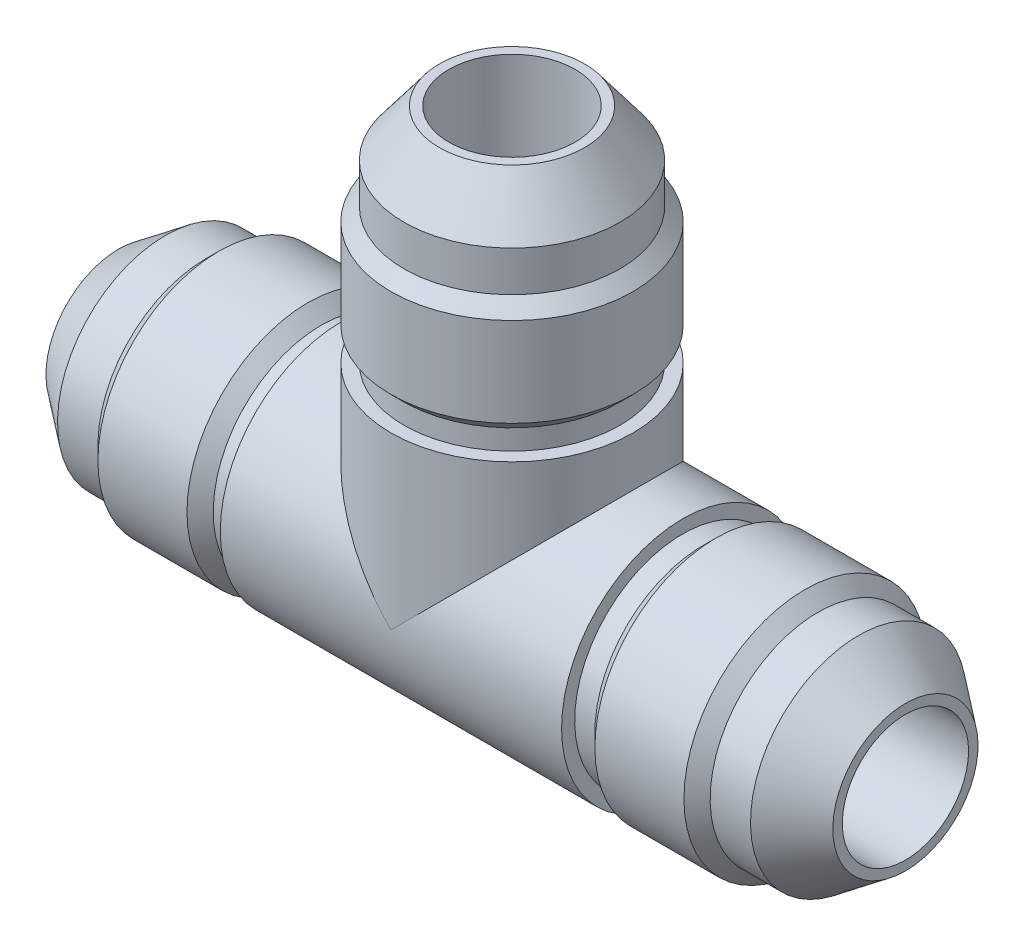
ISO-10303-21;
HEADER;
FILE_DESCRIPTION(('STEP AP214'),'2;1');
FILE_NAME('part.step','',(''),(''),'','','');
FILE_SCHEMA(('AUTOMOTIVE_DESIGN { 1 0 10303 214 1 1 1 1 }'));
ENDSEC;
DATA;
#1=APPLICATION_CONTEXT('core data for automotive mechanical design processes');
#2=APPLICATION_PROTOCOL_DEFINITION('international standard','automotive_design',2000,#1);
#3=PRODUCT_CONTEXT('',#1,'mechanical');
#4=PRODUCT('Part','Part','',(#3));
#5=PRODUCT_RELATED_PRODUCT_CATEGORY('part','',(#4));
#6=PRODUCT_DEFINITION_FORMATION('','',#4);
#7=PRODUCT_DEFINITION_CONTEXT('part definition',#1,'design');
#8=PRODUCT_DEFINITION('design','',#6,#7);
#9=PRODUCT_DEFINITION_SHAPE('','',#8);
#10=(LENGTH_UNIT() NAMED_UNIT(*) SI_UNIT(.MILLI.,.METRE.));
#11=(NAMED_UNIT(*) PLANE_ANGLE_UNIT() SI_UNIT($,.RADIAN.));
#12=(NAMED_UNIT(*) SI_UNIT($,.STERADIAN.) SOLID_ANGLE_UNIT());
#13=UNCERTAINTY_MEASURE_WITH_UNIT(LENGTH_MEASURE(1.E-05),#10,'distance_accuracy_value','');
#14=(GEOMETRIC_REPRESENTATION_CONTEXT(3) GLOBAL_UNCERTAINTY_ASSIGNED_CONTEXT((#13)) GLOBAL_UNIT_ASSIGNED_CONTEXT((#10,
#11,#12)) REPRESENTATION_CONTEXT('',''));
#15=CARTESIAN_POINT('',(0.,0.,0.));
#16=DIRECTION('',(0.,0.,1.));
#17=DIRECTION('',(1.,0.,0.));
#18=AXIS2_PLACEMENT_3D('',#15,#16,#17);
#19=CARTESIAN_POINT('',(0.,0.,0.));
#20=DIRECTION('',(0.,1.,0.));
#21=DIRECTION('',(0.,0.,1.));
#22=AXIS2_PLACEMENT_3D('',#19,#20,#21);
#23=CYLINDRICAL_SURFACE('',#22,9.525);
#24=CARTESIAN_POINT('',(0.,13.4239,0.));
#25=DIRECTION('',(0.,-1.,0.));
#26=DIRECTION('',(0.,0.,-1.));
#27=AXIS2_PLACEMENT_3D('',#24,#25,#26);
#28=CIRCLE('',#27,9.525);
#29=CARTESIAN_POINT('',(0.,13.4239,-9.525));
#30=VERTEX_POINT('',#29);
#31=EDGE_CURVE('E137',#30,#30,#28,.T.);
#32=ORIENTED_EDGE('',*,*,#31,.T.);
#33=EDGE_LOOP('',(#32));
#34=FACE_BOUND('',#33,.T.);
#35=CARTESIAN_POINT('',(0.,0.,0.));
#36=DIRECTION('',(-0.707106781186546,0.707106781186549,0.));
#37=DIRECTION('',(0.707106781186549,0.707106781186546,0.));
#38=AXIS2_PLACEMENT_3D('',#35,#36,#37);
#39=ELLIPSE('',#38,13.4703841816038,9.525);
#40=CARTESIAN_POINT('',(0.,0.,-9.525));
#41=VERTEX_POINT('',#40);
#42=CARTESIAN_POINT('',(0.,0.,9.525));
#43=VERTEX_POINT('',#42);
#44=EDGE_CURVE('E132',#41,#43,#39,.F.);
#45=ORIENTED_EDGE('',*,*,#44,.F.);
#46=CARTESIAN_POINT('',(0.,0.,0.));
#47=DIRECTION('',(0.707106781186549,0.707106781186546,0.));
#48=DIRECTION('',(-0.707106781186546,0.707106781186549,0.));
#49=AXIS2_PLACEMENT_3D('',#46,#47,#48);
#50=ELLIPSE('',#49,13.4703841816037,9.525);
#51=EDGE_CURVE('E59',#43,#41,#50,.F.);
#52=ORIENTED_EDGE('',*,*,#51,.F.);
#53=EDGE_LOOP('',(#45,#52));
#54=FACE_BOUND('',#53,.T.);
#55=ADVANCED_FACE('F40',(#34,#54),#23,.T.);
#56=CARTESIAN_POINT('',(1.08060998289061E-13,30.9499,0.));
#57=DIRECTION('',(0.,-1.,0.));
#58=DIRECTION('',(0.,0.,-1.));
#59=AXIS2_PLACEMENT_3D('',#56,#57,#58);
#60=CYLINDRICAL_SURFACE('',#59,4.9657);
#61=CARTESIAN_POINT('',(1.08060998289061E-13,30.9499,0.));
#62=DIRECTION('',(0.,-1.,0.));
#63=DIRECTION('',(0.,0.,-1.));
#64=AXIS2_PLACEMENT_3D('',#61,#62,#63);
#65=CIRCLE('',#64,4.9657);
#66=CARTESIAN_POINT('',(1.08060998289061E-13,30.9499,-4.9657));
#67=VERTEX_POINT('',#66);
#68=EDGE_CURVE('E134',#67,#67,#65,.T.);
#69=ORIENTED_EDGE('',*,*,#68,.F.);
#70=EDGE_LOOP('',(#69));
#71=FACE_BOUND('',#70,.T.);
#72=CARTESIAN_POINT('',(0.,0.,0.));
#73=DIRECTION('',(-0.707106781186549,-0.707106781186546,0.));
#74=DIRECTION('',(-0.707106781186546,0.707106781186549,0.));
#75=AXIS2_PLACEMENT_3D('',#72,#73,#74);
#76=ELLIPSE('',#75,7.02256028667607,4.9657);
#77=CARTESIAN_POINT('',(0.,0.,-4.9657));
#78=VERTEX_POINT('',#77);
#79=CARTESIAN_POINT('',(0.,0.,4.9657));
#80=VERTEX_POINT('',#79);
#81=EDGE_CURVE('E48',#78,#80,#76,.F.);
#82=ORIENTED_EDGE('',*,*,#81,.F.);
#83=CARTESIAN_POINT('',(0.,0.,0.));
#84=DIRECTION('',(-0.707106781186546,0.707106781186549,0.));
#85=DIRECTION('',(-0.707106781186549,-0.707106781186546,0.));
#86=AXIS2_PLACEMENT_3D('',#83,#84,#85);
#87=ELLIPSE('',#86,7.02256028667609,4.9657);
#88=EDGE_CURVE('E11',#80,#78,#87,.T.);
#89=ORIENTED_EDGE('',*,*,#88,.F.);
#90=EDGE_LOOP('',(#82,#89));
#91=FACE_BOUND('',#90,.T.);
#92=ADVANCED_FACE('F64',(#71,#91),#60,.F.);
#93=CARTESIAN_POINT('',(0.,13.4239,0.));
#94=DIRECTION('',(0.,1.,0.));
#95=DIRECTION('',(0.,0.,1.));
#96=AXIS2_PLACEMENT_3D('',#93,#94,#95);
#97=CYLINDRICAL_SURFACE('',#96,9.525);
#98=CARTESIAN_POINT('',(0.,16.0425114963809,0.));
#99=DIRECTION('',(0.,-1.,0.));
#100=DIRECTION('',(1.,0.,0.));
#101=AXIS2_PLACEMENT_3D('',#98,#99,#100);
#102=CIRCLE('',#101,9.52500000000001);
#103=CARTESIAN_POINT('',(9.52500000000006,16.0425114963808,0.));
#104=VERTEX_POINT('',#103);
#105=EDGE_CURVE('E146',#104,#104,#102,.T.);
#106=ORIENTED_EDGE('',*,*,#105,.F.);
#107=EDGE_LOOP('',(#106));
#108=FACE_BOUND('',#107,.T.);
#109=CARTESIAN_POINT('',(0.,23.0501801907987,0.));
#110=DIRECTION('',(0.,-1.,0.));
#111=DIRECTION('',(1.,0.,0.));
#112=AXIS2_PLACEMENT_3D('',#109,#110,#111);
#113=CIRCLE('',#112,9.52500000000001);
#114=CARTESIAN_POINT('',(9.52500000000008,23.0501801907987,0.));
#115=VERTEX_POINT('',#114);
#116=EDGE_CURVE('E149',#115,#115,#113,.T.);
#117=ORIENTED_EDGE('',*,*,#116,.T.);
#118=EDGE_LOOP('',(#117));
#119=FACE_BOUND('',#118,.T.);
#120=ADVANCED_FACE('F42',(#108,#119),#97,.T.);
#121=CARTESIAN_POINT('',(0.,24.0812916871796,0.));
#122=DIRECTION('',(0.,-1.,0.));
#123=DIRECTION('',(1.,0.,0.));
#124=AXIS2_PLACEMENT_3D('',#121,#122,#123);
#125=CONICAL_SURFACE('',#124,8.49388850361915,0.785398163397452);
#126=ORIENTED_EDGE('',*,*,#116,.F.);
#127=EDGE_LOOP('',(#126));
#128=FACE_BOUND('',#127,.T.);
#129=CARTESIAN_POINT('',(0.,24.0812916871796,0.));
#130=DIRECTION('',(0.,-1.,0.));
#131=DIRECTION('',(1.,0.,0.));
#132=AXIS2_PLACEMENT_3D('',#129,#130,#131);
#133=CIRCLE('',#132,8.49388850361915);
#134=CARTESIAN_POINT('',(8.49388850361923,24.0812916871795,0.));
#135=VERTEX_POINT('',#134);
#136=EDGE_CURVE('E66',#135,#135,#133,.T.);
#137=ORIENTED_EDGE('',*,*,#136,.T.);
#138=EDGE_LOOP('',(#137));
#139=FACE_BOUND('',#138,.T.);
#140=ADVANCED_FACE('F161',(#128,#139),#125,.T.);
#141=CARTESIAN_POINT('',(0.,0.,0.));
#142=DIRECTION('',(0.,-1.,0.));
#143=DIRECTION('',(1.,0.,0.));
#144=AXIS2_PLACEMENT_3D('',#141,#142,#143);
#145=CYLINDRICAL_SURFACE('',#144,8.49388850361915);
#146=ORIENTED_EDGE('',*,*,#136,.F.);
#147=EDGE_LOOP('',(#146));
#148=FACE_BOUND('',#147,.T.);
#149=CARTESIAN_POINT('',(0.,27.2562916871796,0.));
#150=DIRECTION('',(0.,-1.,0.));
#151=DIRECTION('',(1.,0.,0.));
#152=AXIS2_PLACEMENT_3D('',#149,#150,#151);
#153=CIRCLE('',#152,8.49388850361915);
#154=CARTESIAN_POINT('',(8.49388850361924,27.2562916871795,0.));
#155=VERTEX_POINT('',#154);
#156=EDGE_CURVE('E155',#155,#155,#153,.T.);
#157=ORIENTED_EDGE('',*,*,#156,.T.);
#158=EDGE_LOOP('',(#157));
#159=FACE_BOUND('',#158,.T.);
#160=ADVANCED_FACE('F163',(#148,#159),#145,.T.);
#161=CARTESIAN_POINT('',(1.04061451353436E-13,30.9499,0.));
#162=DIRECTION('',(0.,-1.,0.));
#163=DIRECTION('',(1.,0.,0.));
#164=AXIS2_PLACEMENT_3D('',#161,#162,#163);
#165=CONICAL_SURFACE('',#164,5.710555,0.645771823237897);
#166=ORIENTED_EDGE('',*,*,#156,.F.);
#167=EDGE_LOOP('',(#166));
#168=FACE_BOUND('',#167,.T.);
#169=CARTESIAN_POINT('',(1.04061451353436E-13,30.9499,0.));
#170=DIRECTION('',(0.,-1.,0.));
#171=DIRECTION('',(1.,0.,0.));
#172=AXIS2_PLACEMENT_3D('',#169,#170,#171);
#173=CIRCLE('',#172,5.710555);
#174=CARTESIAN_POINT('',(5.71055500000011,30.9499,0.));
#175=VERTEX_POINT('',#174);
#176=EDGE_CURVE('E152',#175,#175,#173,.T.);
#177=ORIENTED_EDGE('',*,*,#176,.T.);
#178=EDGE_LOOP('',(#177));
#179=FACE_BOUND('',#178,.T.);
#180=ADVANCED_FACE('F166',(#168,#179),#165,.T.);
#181=CARTESIAN_POINT('',(1.08060998289061E-13,30.9499,0.));
#182=DIRECTION('',(0.,-1.,0.));
#183=DIRECTION('',(0.,0.,-1.));
#184=AXIS2_PLACEMENT_3D('',#181,#182,#183);
#185=PLANE('',#184);
#186=ORIENTED_EDGE('',*,*,#68,.T.);
#187=EDGE_LOOP('',(#186));
#188=FACE_BOUND('',#187,.T.);
#189=ORIENTED_EDGE('',*,*,#176,.F.);
#190=EDGE_LOOP('',(#189));
#191=FACE_BOUND('',#190,.T.);
#192=ADVANCED_FACE('F172',(#188,#191),#185,.F.);
#193=CARTESIAN_POINT('',(0.,16.0425114963809,0.));
#194=DIRECTION('',(0.,1.,0.));
#195=DIRECTION('',(-1.,0.,0.));
#196=AXIS2_PLACEMENT_3D('',#193,#194,#195);
#197=CONICAL_SURFACE('',#196,9.52500000000001,0.785398163397448);
#198=CARTESIAN_POINT('',(0.,15.0114,0.));
#199=DIRECTION('',(0.,-1.,0.));
#200=DIRECTION('',(1.,0.,0.));
#201=AXIS2_PLACEMENT_3D('',#198,#199,#200);
#202=CIRCLE('',#201,8.49388850361915);
#203=CARTESIAN_POINT('',(8.4938885036192,15.0114,0.));
#204=VERTEX_POINT('',#203);
#205=EDGE_CURVE('E143',#204,#204,#202,.T.);
#206=ORIENTED_EDGE('',*,*,#205,.F.);
#207=EDGE_LOOP('',(#206));
#208=FACE_BOUND('',#207,.T.);
#209=ORIENTED_EDGE('',*,*,#105,.T.);
#210=EDGE_LOOP('',(#209));
#211=FACE_BOUND('',#210,.T.);
#212=ADVANCED_FACE('F177',(#208,#211),#197,.T.);
#213=CARTESIAN_POINT('',(0.,0.,0.));
#214=DIRECTION('',(0.,-1.,0.));
#215=DIRECTION('',(1.,0.,0.));
#216=AXIS2_PLACEMENT_3D('',#213,#214,#215);
#217=CYLINDRICAL_SURFACE('',#216,8.49388850361915);
#218=CARTESIAN_POINT('',(0.,13.4239,0.));
#219=DIRECTION('',(0.,-1.,0.));
#220=DIRECTION('',(1.,0.,0.));
#221=AXIS2_PLACEMENT_3D('',#218,#219,#220);
#222=CIRCLE('',#221,8.49388850361915);
#223=CARTESIAN_POINT('',(8.49388850361919,13.4239,0.));
#224=VERTEX_POINT('',#223);
#225=EDGE_CURVE('E140',#224,#224,#222,.T.);
#226=ORIENTED_EDGE('',*,*,#225,.F.);
#227=EDGE_LOOP('',(#226));
#228=FACE_BOUND('',#227,.T.);
#229=ORIENTED_EDGE('',*,*,#205,.T.);
#230=EDGE_LOOP('',(#229));
#231=FACE_BOUND('',#230,.T.);
#232=ADVANCED_FACE('F182',(#228,#231),#217,.T.);
#233=CARTESIAN_POINT('',(0.,13.4239,0.));
#234=DIRECTION('',(0.,-1.,0.));
#235=DIRECTION('',(0.,0.,-1.));
#236=AXIS2_PLACEMENT_3D('',#233,#234,#235);
#237=PLANE('',#236);
#238=ORIENTED_EDGE('',*,*,#31,.F.);
#239=EDGE_LOOP('',(#238));
#240=FACE_BOUND('',#239,.T.);
#241=ORIENTED_EDGE('',*,*,#225,.T.);
#242=EDGE_LOOP('',(#241));
#243=FACE_BOUND('',#242,.T.);
#244=ADVANCED_FACE('F196',(#240,#243),#237,.F.);
#245=CARTESIAN_POINT('',(0.,0.,0.));
#246=DIRECTION('',(-1.,0.,0.));
#247=DIRECTION('',(0.,0.,1.));
#248=AXIS2_PLACEMENT_3D('',#245,#246,#247);
#249=CYLINDRICAL_SURFACE('',#248,9.525);
#250=CARTESIAN_POINT('',(13.4239,0.,0.));
#251=DIRECTION('',(-1.,0.,0.));
#252=DIRECTION('',(0.,0.,-1.));
#253=AXIS2_PLACEMENT_3D('',#250,#251,#252);
#254=CIRCLE('',#253,9.525);
#255=CARTESIAN_POINT('',(13.4239,0.,-9.525));
#256=VERTEX_POINT('',#255);
#257=EDGE_CURVE('E80',#256,#256,#254,.T.);
#258=ORIENTED_EDGE('',*,*,#257,.T.);
#259=EDGE_LOOP('',(#258));
#260=FACE_BOUND('',#259,.T.);
#261=CARTESIAN_POINT('',(-13.4239,0.,0.));
#262=DIRECTION('',(1.,0.,0.));
#263=DIRECTION('',(0.,0.,-1.));
#264=AXIS2_PLACEMENT_3D('',#261,#262,#263);
#265=CIRCLE('',#264,9.525);
#266=CARTESIAN_POINT('',(-13.4239,0.,-9.525));
#267=VERTEX_POINT('',#266);
#268=EDGE_CURVE('E107',#267,#267,#265,.T.);
#269=ORIENTED_EDGE('',*,*,#268,.T.);
#270=EDGE_LOOP('',(#269));
#271=FACE_BOUND('',#270,.T.);
#272=ORIENTED_EDGE('',*,*,#51,.T.);
#273=ORIENTED_EDGE('',*,*,#44,.T.);
#274=EDGE_LOOP('',(#272,#273));
#275=FACE_BOUND('',#274,.T.);
#276=ADVANCED_FACE('F338',(#260,#271,#275),#249,.T.);
#277=CARTESIAN_POINT('',(-13.4239,0.,0.));
#278=DIRECTION('',(-1.,0.,0.));
#279=DIRECTION('',(0.,0.,1.));
#280=AXIS2_PLACEMENT_3D('',#277,#278,#279);
#281=CYLINDRICAL_SURFACE('',#280,9.525);
#282=CARTESIAN_POINT('',(-16.0425114963809,0.,0.));
#283=DIRECTION('',(1.,0.,0.));
#284=DIRECTION('',(0.,1.,0.));
#285=AXIS2_PLACEMENT_3D('',#282,#283,#284);
#286=CIRCLE('',#285,9.52500000000001);
#287=CARTESIAN_POINT('',(-16.0425114963809,9.525,0.));
#288=VERTEX_POINT('',#287);
#289=EDGE_CURVE('E116',#288,#288,#286,.T.);
#290=ORIENTED_EDGE('',*,*,#289,.F.);
#291=EDGE_LOOP('',(#290));
#292=FACE_BOUND('',#291,.T.);
#293=CARTESIAN_POINT('',(-23.0501801907987,0.,0.));
#294=DIRECTION('',(1.,0.,0.));
#295=DIRECTION('',(0.,1.,0.));
#296=AXIS2_PLACEMENT_3D('',#293,#294,#295);
#297=CIRCLE('',#296,9.52500000000001);
#298=CARTESIAN_POINT('',(-23.0501801907987,9.525,0.));
#299=VERTEX_POINT('',#298);
#300=EDGE_CURVE('E119',#299,#299,#297,.T.);
#301=ORIENTED_EDGE('',*,*,#300,.T.);
#302=EDGE_LOOP('',(#301));
#303=FACE_BOUND('',#302,.T.);
#304=ADVANCED_FACE('F331',(#292,#303),#281,.T.);
#305=CARTESIAN_POINT('',(-24.0812916871796,0.,0.));
#306=DIRECTION('',(1.,0.,0.));
#307=DIRECTION('',(0.,1.,0.));
#308=AXIS2_PLACEMENT_3D('',#305,#306,#307);
#309=CONICAL_SURFACE('',#308,8.49388850361915,0.785398163397452);
#310=ORIENTED_EDGE('',*,*,#300,.F.);
#311=EDGE_LOOP('',(#310));
#312=FACE_BOUND('',#311,.T.);
#313=CARTESIAN_POINT('',(-24.0812916871796,0.,0.));
#314=DIRECTION('',(1.,0.,0.));
#315=DIRECTION('',(0.,1.,0.));
#316=AXIS2_PLACEMENT_3D('',#313,#314,#315);
#317=CIRCLE('',#316,8.49388850361915);
#318=CARTESIAN_POINT('',(-24.0812916871796,8.49388850361915,0.));
#319=VERTEX_POINT('',#318);
#320=EDGE_CURVE('E128',#319,#319,#317,.T.);
#321=ORIENTED_EDGE('',*,*,#320,.T.);
#322=EDGE_LOOP('',(#321));
#323=FACE_BOUND('',#322,.T.);
#324=ADVANCED_FACE('F324',(#312,#323),#309,.T.);
#325=CARTESIAN_POINT('',(0.,0.,0.));
#326=DIRECTION('',(1.,0.,0.));
#327=DIRECTION('',(0.,1.,0.));
#328=AXIS2_PLACEMENT_3D('',#325,#326,#327);
#329=CYLINDRICAL_SURFACE('',#328,8.49388850361915);
#330=ORIENTED_EDGE('',*,*,#320,.F.);
#331=EDGE_LOOP('',(#330));
#332=FACE_BOUND('',#331,.T.);
#333=CARTESIAN_POINT('',(-27.2562916871796,0.,0.));
#334=DIRECTION('',(1.,0.,0.));
#335=DIRECTION('',(0.,1.,0.));
#336=AXIS2_PLACEMENT_3D('',#333,#334,#335);
#337=CIRCLE('',#336,8.49388850361915);
#338=CARTESIAN_POINT('',(-27.2562916871796,8.49388850361915,0.));
#339=VERTEX_POINT('',#338);
#340=EDGE_CURVE('E125',#339,#339,#337,.T.);
#341=ORIENTED_EDGE('',*,*,#340,.T.);
#342=EDGE_LOOP('',(#341));
#343=FACE_BOUND('',#342,.T.);
#344=ADVANCED_FACE('F317',(#332,#343),#329,.T.);
#345=CARTESIAN_POINT('',(-30.9499,0.,0.));
#346=DIRECTION('',(1.,0.,0.));
#347=DIRECTION('',(0.,1.,0.));
#348=AXIS2_PLACEMENT_3D('',#345,#346,#347);
#349=CONICAL_SURFACE('',#348,5.710555,0.645771823237897);
#350=ORIENTED_EDGE('',*,*,#340,.F.);
#351=EDGE_LOOP('',(#350));
#352=FACE_BOUND('',#351,.T.);
#353=CARTESIAN_POINT('',(-30.9499,0.,0.));
#354=DIRECTION('',(1.,0.,0.));
#355=DIRECTION('',(0.,1.,0.));
#356=AXIS2_PLACEMENT_3D('',#353,#354,#355);
#357=CIRCLE('',#356,5.710555);
#358=CARTESIAN_POINT('',(-30.9499,5.710555,0.));
#359=VERTEX_POINT('',#358);
#360=EDGE_CURVE('E122',#359,#359,#357,.T.);
#361=ORIENTED_EDGE('',*,*,#360,.T.);
#362=EDGE_LOOP('',(#361));
#363=FACE_BOUND('',#362,.T.);
#364=ADVANCED_FACE('F310',(#352,#363),#349,.T.);
#365=CARTESIAN_POINT('',(-30.9499,0.,0.));
#366=DIRECTION('',(1.,0.,0.));
#367=DIRECTION('',(0.,0.,-1.));
#368=AXIS2_PLACEMENT_3D('',#365,#366,#367);
#369=PLANE('',#368);
#370=CARTESIAN_POINT('',(-30.9499,0.,0.));
#371=DIRECTION('',(1.,0.,0.));
#372=DIRECTION('',(0.,0.,-1.));
#373=AXIS2_PLACEMENT_3D('',#370,#371,#372);
#374=CIRCLE('',#373,4.9657);
#375=CARTESIAN_POINT('',(-30.9499,0.,-4.9657));
#376=VERTEX_POINT('',#375);
#377=EDGE_CURVE('E75',#376,#376,#374,.T.);
#378=ORIENTED_EDGE('',*,*,#377,.T.);
#379=EDGE_LOOP('',(#378));
#380=FACE_BOUND('',#379,.T.);
#381=ORIENTED_EDGE('',*,*,#360,.F.);
#382=EDGE_LOOP('',(#381));
#383=FACE_BOUND('',#382,.T.);
#384=ADVANCED_FACE('F303',(#380,#383),#369,.F.);
#385=CARTESIAN_POINT('',(-16.0425114963809,0.,0.));
#386=DIRECTION('',(-1.,0.,0.));
#387=DIRECTION('',(0.,-1.,0.));
#388=AXIS2_PLACEMENT_3D('',#385,#386,#387);
#389=CONICAL_SURFACE('',#388,9.52500000000001,0.785398163397448);
#390=CARTESIAN_POINT('',(-15.0114,0.,0.));
#391=DIRECTION('',(1.,0.,0.));
#392=DIRECTION('',(0.,1.,0.));
#393=AXIS2_PLACEMENT_3D('',#390,#391,#392);
#394=CIRCLE('',#393,8.49388850361915);
#395=CARTESIAN_POINT('',(-15.0114,8.49388850361915,0.));
#396=VERTEX_POINT('',#395);
#397=EDGE_CURVE('E113',#396,#396,#394,.T.);
#398=ORIENTED_EDGE('',*,*,#397,.F.);
#399=EDGE_LOOP('',(#398));
#400=FACE_BOUND('',#399,.T.);
#401=ORIENTED_EDGE('',*,*,#289,.T.);
#402=EDGE_LOOP('',(#401));
#403=FACE_BOUND('',#402,.T.);
#404=ADVANCED_FACE('F296',(#400,#403),#389,.T.);
#405=CARTESIAN_POINT('',(0.,0.,0.));
#406=DIRECTION('',(1.,0.,0.));
#407=DIRECTION('',(0.,1.,0.));
#408=AXIS2_PLACEMENT_3D('',#405,#406,#407);
#409=CYLINDRICAL_SURFACE('',#408,8.49388850361915);
#410=CARTESIAN_POINT('',(-13.4239,0.,0.));
#411=DIRECTION('',(1.,0.,0.));
#412=DIRECTION('',(0.,1.,0.));
#413=AXIS2_PLACEMENT_3D('',#410,#411,#412);
#414=CIRCLE('',#413,8.49388850361915);
#415=CARTESIAN_POINT('',(-13.4239,8.49388850361915,0.));
#416=VERTEX_POINT('',#415);
#417=EDGE_CURVE('E110',#416,#416,#414,.T.);
#418=ORIENTED_EDGE('',*,*,#417,.F.);
#419=EDGE_LOOP('',(#418));
#420=FACE_BOUND('',#419,.T.);
#421=ORIENTED_EDGE('',*,*,#397,.T.);
#422=EDGE_LOOP('',(#421));
#423=FACE_BOUND('',#422,.T.);
#424=ADVANCED_FACE('F289',(#420,#423),#409,.T.);
#425=CARTESIAN_POINT('',(-13.4239,0.,0.));
#426=DIRECTION('',(1.,0.,0.));
#427=DIRECTION('',(0.,0.,-1.));
#428=AXIS2_PLACEMENT_3D('',#425,#426,#427);
#429=PLANE('',#428);
#430=ORIENTED_EDGE('',*,*,#268,.F.);
#431=EDGE_LOOP('',(#430));
#432=FACE_BOUND('',#431,.T.);
#433=ORIENTED_EDGE('',*,*,#417,.T.);
#434=EDGE_LOOP('',(#433));
#435=FACE_BOUND('',#434,.T.);
#436=ADVANCED_FACE('F281',(#432,#435),#429,.F.);
#437=CARTESIAN_POINT('',(13.4239,0.,0.));
#438=DIRECTION('',(1.,0.,0.));
#439=DIRECTION('',(0.,0.,1.));
#440=AXIS2_PLACEMENT_3D('',#437,#438,#439);
#441=CYLINDRICAL_SURFACE('',#440,9.525);
#442=CARTESIAN_POINT('',(16.0425114963809,-1.09951141587864E-13,0.));
#443=DIRECTION('',(-1.,0.,0.));
#444=DIRECTION('',(0.,-1.,0.));
#445=AXIS2_PLACEMENT_3D('',#442,#443,#444);
#446=CIRCLE('',#445,9.52500000000001);
#447=CARTESIAN_POINT('',(16.0425114963808,-9.52500000000012,0.));
#448=VERTEX_POINT('',#447);
#449=EDGE_CURVE('E91',#448,#448,#446,.T.);
#450=ORIENTED_EDGE('',*,*,#449,.F.);
#451=EDGE_LOOP('',(#450));
#452=FACE_BOUND('',#451,.T.);
#453=CARTESIAN_POINT('',(23.0501801907987,-1.57979854111748E-13,0.));
#454=DIRECTION('',(-1.,0.,0.));
#455=DIRECTION('',(0.,-1.,0.));
#456=AXIS2_PLACEMENT_3D('',#453,#454,#455);
#457=CIRCLE('',#456,9.52500000000001);
#458=CARTESIAN_POINT('',(23.0501801907987,-9.52500000000016,0.));
#459=VERTEX_POINT('',#458);
#460=EDGE_CURVE('E94',#459,#459,#457,.T.);
#461=ORIENTED_EDGE('',*,*,#460,.T.);
#462=EDGE_LOOP('',(#461));
#463=FACE_BOUND('',#462,.T.);
#464=ADVANCED_FACE('F273',(#452,#463),#441,.T.);
#465=CARTESIAN_POINT('',(24.0812916871796,-1.65046820288274E-13,0.));
#466=DIRECTION('',(-1.,0.,0.));
#467=DIRECTION('',(0.,-1.,0.));
#468=AXIS2_PLACEMENT_3D('',#465,#466,#467);
#469=CONICAL_SURFACE('',#468,8.49388850361915,0.785398163397452);
#470=ORIENTED_EDGE('',*,*,#460,.F.);
#471=EDGE_LOOP('',(#470));
#472=FACE_BOUND('',#471,.T.);
#473=CARTESIAN_POINT('',(24.0812916871796,-1.65046820288274E-13,0.));
#474=DIRECTION('',(-1.,0.,0.));
#475=DIRECTION('',(0.,-1.,0.));
#476=AXIS2_PLACEMENT_3D('',#473,#474,#475);
#477=CIRCLE('',#476,8.49388850361915);
#478=CARTESIAN_POINT('',(24.0812916871795,-8.49388850361932,0.));
#479=VERTEX_POINT('',#478);
#480=EDGE_CURVE('E103',#479,#479,#477,.T.);
#481=ORIENTED_EDGE('',*,*,#480,.T.);
#482=EDGE_LOOP('',(#481));
#483=FACE_BOUND('',#482,.T.);
#484=ADVANCED_FACE('F266',(#472,#483),#469,.T.);
#485=CARTESIAN_POINT('',(0.,0.,0.));
#486=DIRECTION('',(-1.,0.,0.));
#487=DIRECTION('',(0.,-1.,0.));
#488=AXIS2_PLACEMENT_3D('',#485,#486,#487);
#489=CYLINDRICAL_SURFACE('',#488,8.49388850361915);
#490=ORIENTED_EDGE('',*,*,#480,.F.);
#491=EDGE_LOOP('',(#490));
#492=FACE_BOUND('',#491,.T.);
#493=CARTESIAN_POINT('',(27.2562916871796,-1.86807432684919E-13,0.));
#494=DIRECTION('',(-1.,0.,0.));
#495=DIRECTION('',(0.,-1.,0.));
#496=AXIS2_PLACEMENT_3D('',#493,#494,#495);
#497=CIRCLE('',#496,8.49388850361915);
#498=CARTESIAN_POINT('',(27.2562916871795,-8.49388850361934,0.));
#499=VERTEX_POINT('',#498);
#500=EDGE_CURVE('E100',#499,#499,#497,.T.);
#501=ORIENTED_EDGE('',*,*,#500,.T.);
#502=EDGE_LOOP('',(#501));
#503=FACE_BOUND('',#502,.T.);
#504=ADVANCED_FACE('F259',(#492,#503),#489,.T.);
#505=CARTESIAN_POINT('',(30.9499,-2.12122449642497E-13,0.));
#506=DIRECTION('',(-1.,0.,0.));
#507=DIRECTION('',(0.,-1.,0.));
#508=AXIS2_PLACEMENT_3D('',#505,#506,#507);
#509=CONICAL_SURFACE('',#508,5.710555,0.645771823237897);
#510=ORIENTED_EDGE('',*,*,#500,.F.);
#511=EDGE_LOOP('',(#510));
#512=FACE_BOUND('',#511,.T.);
#513=CARTESIAN_POINT('',(30.9499,-2.12122449642497E-13,0.));
#514=DIRECTION('',(-1.,0.,0.));
#515=DIRECTION('',(0.,-1.,0.));
#516=AXIS2_PLACEMENT_3D('',#513,#514,#515);
#517=CIRCLE('',#516,5.710555);
#518=CARTESIAN_POINT('',(30.9499,-5.71055500000022,0.));
#519=VERTEX_POINT('',#518);
#520=EDGE_CURVE('E97',#519,#519,#517,.T.);
#521=ORIENTED_EDGE('',*,*,#520,.T.);
#522=EDGE_LOOP('',(#521));
#523=FACE_BOUND('',#522,.T.);
#524=ADVANCED_FACE('F253',(#512,#523),#509,.T.);
#525=CARTESIAN_POINT('',(30.9499,-2.16121996578122E-13,0.));
#526=DIRECTION('',(-1.,0.,0.));
#527=DIRECTION('',(0.,0.,-1.));
#528=AXIS2_PLACEMENT_3D('',#525,#526,#527);
#529=PLANE('',#528);
#530=CARTESIAN_POINT('',(30.9499,-2.16121996578122E-13,0.));
#531=DIRECTION('',(-1.,0.,0.));
#532=DIRECTION('',(0.,0.,-1.));
#533=AXIS2_PLACEMENT_3D('',#530,#531,#532);
#534=CIRCLE('',#533,4.9657);
#535=CARTESIAN_POINT('',(30.9499,-2.16121996578122E-13,-4.9657));
#536=VERTEX_POINT('',#535);
#537=EDGE_CURVE('E78',#536,#536,#534,.T.);
#538=ORIENTED_EDGE('',*,*,#537,.T.);
#539=EDGE_LOOP('',(#538));
#540=FACE_BOUND('',#539,.T.);
#541=ORIENTED_EDGE('',*,*,#520,.F.);
#542=EDGE_LOOP('',(#541));
#543=FACE_BOUND('',#542,.T.);
#544=ADVANCED_FACE('F246',(#540,#543),#529,.F.);
#545=CARTESIAN_POINT('',(16.0425114963809,-1.09951141587864E-13,0.));
#546=DIRECTION('',(1.,0.,0.));
#547=DIRECTION('',(0.,1.,0.));
#548=AXIS2_PLACEMENT_3D('',#545,#546,#547);
#549=CONICAL_SURFACE('',#548,9.52500000000001,0.785398163397448);
#550=CARTESIAN_POINT('',(15.0114,-1.02884175411338E-13,0.));
#551=DIRECTION('',(-1.,0.,0.));
#552=DIRECTION('',(0.,-1.,0.));
#553=AXIS2_PLACEMENT_3D('',#550,#551,#552);
#554=CIRCLE('',#553,8.49388850361915);
#555=CARTESIAN_POINT('',(15.0113999999999,-8.49388850361925,0.));
#556=VERTEX_POINT('',#555);
#557=EDGE_CURVE('E88',#556,#556,#554,.T.);
#558=ORIENTED_EDGE('',*,*,#557,.F.);
#559=EDGE_LOOP('',(#558));
#560=FACE_BOUND('',#559,.T.);
#561=ORIENTED_EDGE('',*,*,#449,.T.);
#562=EDGE_LOOP('',(#561));
#563=FACE_BOUND('',#562,.T.);
#564=ADVANCED_FACE('F240',(#560,#563),#549,.T.);
#565=CARTESIAN_POINT('',(0.,0.,0.));
#566=DIRECTION('',(-1.,0.,0.));
#567=DIRECTION('',(0.,-1.,0.));
#568=AXIS2_PLACEMENT_3D('',#565,#566,#567);
#569=CYLINDRICAL_SURFACE('',#568,8.49388850361915);
#570=CARTESIAN_POINT('',(13.4239,0.,0.));
#571=DIRECTION('',(-1.,0.,0.));
#572=DIRECTION('',(0.,-1.,0.));
#573=AXIS2_PLACEMENT_3D('',#570,#571,#572);
#574=CIRCLE('',#573,8.49388850361915);
#575=CARTESIAN_POINT('',(13.4238999999999,-8.49388850361924,0.));
#576=VERTEX_POINT('',#575);
#577=EDGE_CURVE('E83',#576,#576,#574,.T.);
#578=ORIENTED_EDGE('',*,*,#577,.F.);
#579=EDGE_LOOP('',(#578));
#580=FACE_BOUND('',#579,.T.);
#581=ORIENTED_EDGE('',*,*,#557,.T.);
#582=EDGE_LOOP('',(#581));
#583=FACE_BOUND('',#582,.T.);
#584=ADVANCED_FACE('F234',(#580,#583),#569,.T.);
#585=CARTESIAN_POINT('',(13.4239,0.,0.));
#586=DIRECTION('',(-1.,0.,0.));
#587=DIRECTION('',(0.,0.,-1.));
#588=AXIS2_PLACEMENT_3D('',#585,#586,#587);
#589=PLANE('',#588);
#590=ORIENTED_EDGE('',*,*,#257,.F.);
#591=EDGE_LOOP('',(#590));
#592=FACE_BOUND('',#591,.T.);
#593=ORIENTED_EDGE('',*,*,#577,.T.);
#594=EDGE_LOOP('',(#593));
#595=FACE_BOUND('',#594,.T.);
#596=ADVANCED_FACE('F70',(#592,#595),#589,.F.);
#597=CARTESIAN_POINT('',(30.9499,0.,0.));
#598=DIRECTION('',(-1.,0.,0.));
#599=DIRECTION('',(0.,0.,1.));
#600=AXIS2_PLACEMENT_3D('',#597,#598,#599);
#601=CYLINDRICAL_SURFACE('',#600,4.9657);
#602=ORIENTED_EDGE('',*,*,#81,.T.);
#603=ORIENTED_EDGE('',*,*,#88,.T.);
#604=EDGE_LOOP('',(#602,#603));
#605=FACE_BOUND('',#604,.T.);
#606=ORIENTED_EDGE('',*,*,#377,.F.);
#607=EDGE_LOOP('',(#606));
#608=FACE_BOUND('',#607,.T.);
#609=ORIENTED_EDGE('',*,*,#537,.F.);
#610=EDGE_LOOP('',(#609));
#611=FACE_BOUND('',#610,.T.);
#612=ADVANCED_FACE('F67',(#605,#608,#611),#601,.F.);
#613=CLOSED_SHELL('',(#55,#92,#120,#140,#160,#180,#192,#212,#232,#244,#276,#304,#324,#344,#364,
#384,#404,#424,#436,#464,#484,#504,#524,#544,#564,#584,#596,#612));
#614=MANIFOLD_SOLID_BREP('B2',#613);
#615=ADVANCED_BREP_SHAPE_REPRESENTATION('',(#18,#614),#14);
#616=SHAPE_DEFINITION_REPRESENTATION(#9,#615);
ENDSEC;
END-ISO-10303-21;
